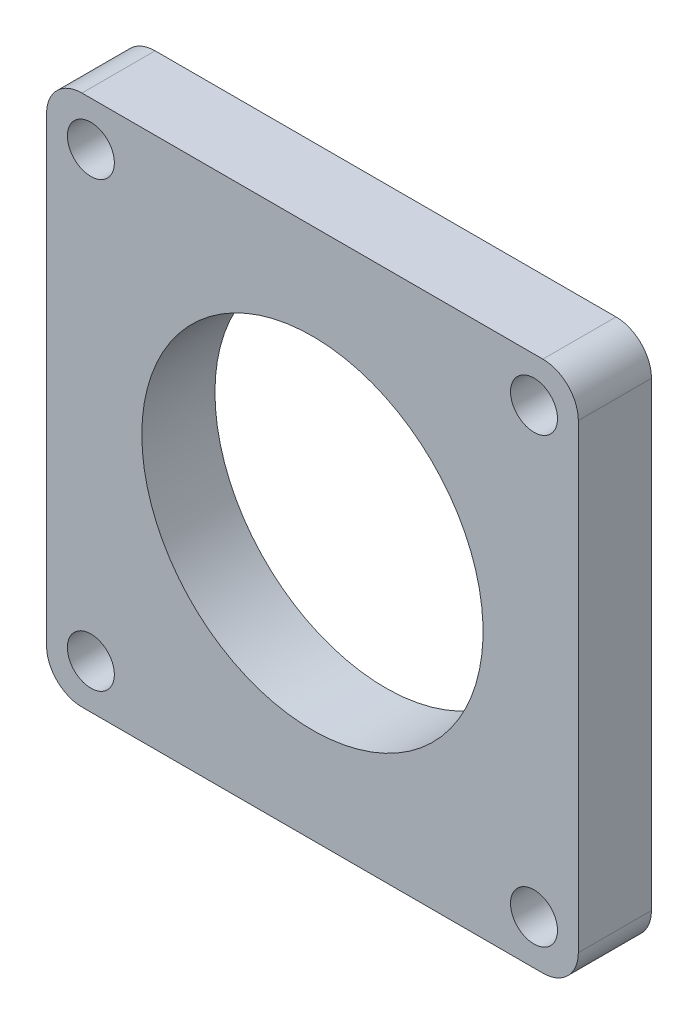
ISO-10303-21;
HEADER;
FILE_DESCRIPTION(('STEP AP214'),'2;1');
FILE_NAME('part.step','',(''),(''),'','','');
FILE_SCHEMA(('AUTOMOTIVE_DESIGN { 1 0 10303 214 1 1 1 1 }'));
ENDSEC;
DATA;
#1=APPLICATION_CONTEXT('core data for automotive mechanical design processes');
#2=APPLICATION_PROTOCOL_DEFINITION('international standard','automotive_design',2000,#1);
#3=PRODUCT_CONTEXT('',#1,'mechanical');
#4=PRODUCT('Part','Part','',(#3));
#5=PRODUCT_RELATED_PRODUCT_CATEGORY('part','',(#4));
#6=PRODUCT_DEFINITION_FORMATION('','',#4);
#7=PRODUCT_DEFINITION_CONTEXT('part definition',#1,'design');
#8=PRODUCT_DEFINITION('design','',#6,#7);
#9=PRODUCT_DEFINITION_SHAPE('','',#8);
#10=(LENGTH_UNIT() NAMED_UNIT(*) SI_UNIT(.MILLI.,.METRE.));
#11=(NAMED_UNIT(*) PLANE_ANGLE_UNIT() SI_UNIT($,.RADIAN.));
#12=(NAMED_UNIT(*) SI_UNIT($,.STERADIAN.) SOLID_ANGLE_UNIT());
#13=UNCERTAINTY_MEASURE_WITH_UNIT(LENGTH_MEASURE(1.E-05),#10,'distance_accuracy_value','');
#14=(GEOMETRIC_REPRESENTATION_CONTEXT(3) GLOBAL_UNCERTAINTY_ASSIGNED_CONTEXT((#13)) GLOBAL_UNIT_ASSIGNED_CONTEXT((#10,
#11,#12)) REPRESENTATION_CONTEXT('',''));
#15=CARTESIAN_POINT('',(0.,0.,0.));
#16=DIRECTION('',(0.,0.,1.));
#17=DIRECTION('',(1.,0.,0.));
#18=AXIS2_PLACEMENT_3D('',#15,#16,#17);
#19=CARTESIAN_POINT('',(26.,-26.,-4.1250000000001));
#20=DIRECTION('',(0.,0.,1.));
#21=DIRECTION('',(1.,0.,0.));
#22=AXIS2_PLACEMENT_3D('',#19,#20,#21);
#23=CYLINDRICAL_SURFACE('',#22,4.00000000000001);
#24=CARTESIAN_POINT('',(26.,-26.,4.12500000000021));
#25=DIRECTION('',(0.,0.,1.));
#26=DIRECTION('',(1.,0.,0.));
#27=AXIS2_PLACEMENT_3D('',#24,#25,#26);
#28=CIRCLE('',#27,4.00000000000001);
#29=CARTESIAN_POINT('',(26.,-30.,4.12500000000021));
#30=VERTEX_POINT('',#29);
#31=CARTESIAN_POINT('',(30.,-26.0000000000001,4.12500000000016));
#32=VERTEX_POINT('',#31);
#33=EDGE_CURVE('E139',#30,#32,#28,.T.);
#34=ORIENTED_EDGE('',*,*,#33,.F.);
#35=DIRECTION('',(0.,0.,1.));
#36=VECTOR('',#35,1.);
#37=CARTESIAN_POINT('',(26.,-30.,-4.1250000000001));
#38=LINE('',#37,#36);
#39=CARTESIAN_POINT('',(26.,-30.,-4.1250000000001));
#40=VERTEX_POINT('',#39);
#41=EDGE_CURVE('E13',#40,#30,#38,.T.);
#42=ORIENTED_EDGE('',*,*,#41,.F.);
#43=CARTESIAN_POINT('',(26.,-26.,-4.1250000000001));
#44=DIRECTION('',(0.,0.,1.));
#45=DIRECTION('',(1.,0.,0.));
#46=AXIS2_PLACEMENT_3D('',#43,#44,#45);
#47=CIRCLE('',#46,4.00000000000001);
#48=CARTESIAN_POINT('',(30.,-26.0000000000001,-4.12500000000016));
#49=VERTEX_POINT('',#48);
#50=EDGE_CURVE('E160',#40,#49,#47,.T.);
#51=ORIENTED_EDGE('',*,*,#50,.T.);
#52=DIRECTION('',(0.,0.,1.));
#53=VECTOR('',#52,1.);
#54=CARTESIAN_POINT('',(30.,-26.0000000000001,-4.12500000000016));
#55=LINE('',#54,#53);
#56=EDGE_CURVE('E45',#49,#32,#55,.T.);
#57=ORIENTED_EDGE('',*,*,#56,.T.);
#58=EDGE_LOOP('',(#34,#42,#51,#57));
#59=FACE_BOUND('',#58,.T.);
#60=ADVANCED_FACE('F42',(#59),#23,.T.);
#61=CARTESIAN_POINT('',(-26.,-30.0000000000001,-4.12499999999993));
#62=DIRECTION('',(0.,-1.,0.));
#63=DIRECTION('',(1.,0.,0.));
#64=AXIS2_PLACEMENT_3D('',#61,#62,#63);
#65=PLANE('',#64);
#66=DIRECTION('',(1.,0.,0.));
#67=VECTOR('',#66,1.);
#68=CARTESIAN_POINT('',(-26.,-29.9999999999999,4.12500000000016));
#69=LINE('',#68,#67);
#70=CARTESIAN_POINT('',(-26.,-29.9999999999999,4.12500000000016));
#71=VERTEX_POINT('',#70);
#72=EDGE_CURVE('E158',#71,#30,#69,.T.);
#73=ORIENTED_EDGE('',*,*,#72,.F.);
#74=DIRECTION('',(0.,0.,1.));
#75=VECTOR('',#74,1.);
#76=CARTESIAN_POINT('',(-26.,-30.0000000000001,-4.12499999999993));
#77=LINE('',#76,#75);
#78=CARTESIAN_POINT('',(-26.,-30.0000000000001,-4.12499999999993));
#79=VERTEX_POINT('',#78);
#80=EDGE_CURVE('E51',#79,#71,#77,.T.);
#81=ORIENTED_EDGE('',*,*,#80,.F.);
#82=DIRECTION('',(1.,0.,0.));
#83=VECTOR('',#82,1.);
#84=CARTESIAN_POINT('',(-26.,-30.0000000000001,-4.12499999999993));
#85=LINE('',#84,#83);
#86=EDGE_CURVE('E129',#79,#40,#85,.T.);
#87=ORIENTED_EDGE('',*,*,#86,.T.);
#88=ORIENTED_EDGE('',*,*,#41,.T.);
#89=EDGE_LOOP('',(#73,#81,#87,#88));
#90=FACE_BOUND('',#89,.T.);
#91=ADVANCED_FACE('F172',(#90),#65,.T.);
#92=CARTESIAN_POINT('',(-26.,-26.0000000000001,-4.12499999999993));
#93=DIRECTION('',(0.,0.,1.));
#94=DIRECTION('',(1.,0.,0.));
#95=AXIS2_PLACEMENT_3D('',#92,#93,#94);
#96=CYLINDRICAL_SURFACE('',#95,4.00000000000001);
#97=CARTESIAN_POINT('',(-26.,-25.9999999999999,4.12500000000016));
#98=DIRECTION('',(0.,0.,1.));
#99=DIRECTION('',(1.,0.,0.));
#100=AXIS2_PLACEMENT_3D('',#97,#98,#99);
#101=CIRCLE('',#100,4.00000000000001);
#102=CARTESIAN_POINT('',(-30.,-26.,4.12500000000021));
#103=VERTEX_POINT('',#102);
#104=EDGE_CURVE('E116',#103,#71,#101,.T.);
#105=ORIENTED_EDGE('',*,*,#104,.F.);
#106=DIRECTION('',(0.,0.,1.));
#107=VECTOR('',#106,1.);
#108=CARTESIAN_POINT('',(-30.,-26.,-4.12499999999966));
#109=LINE('',#108,#107);
#110=CARTESIAN_POINT('',(-30.,-26.,-4.12499999999966));
#111=VERTEX_POINT('',#110);
#112=EDGE_CURVE('E111',#111,#103,#109,.T.);
#113=ORIENTED_EDGE('',*,*,#112,.F.);
#114=CARTESIAN_POINT('',(-26.,-26.0000000000001,-4.12499999999993));
#115=DIRECTION('',(0.,0.,1.));
#116=DIRECTION('',(1.,0.,0.));
#117=AXIS2_PLACEMENT_3D('',#114,#115,#116);
#118=CIRCLE('',#117,4.00000000000001);
#119=EDGE_CURVE('E114',#111,#79,#118,.T.);
#120=ORIENTED_EDGE('',*,*,#119,.T.);
#121=ORIENTED_EDGE('',*,*,#80,.T.);
#122=EDGE_LOOP('',(#105,#113,#120,#121));
#123=FACE_BOUND('',#122,.T.);
#124=ADVANCED_FACE('F113',(#123),#96,.T.);
#125=CARTESIAN_POINT('',(-30.,26.,-4.1250000000001));
#126=DIRECTION('',(-1.,0.,0.));
#127=DIRECTION('',(0.,-1.,0.));
#128=AXIS2_PLACEMENT_3D('',#125,#126,#127);
#129=PLANE('',#128);
#130=DIRECTION('',(0.,-1.,0.));
#131=VECTOR('',#130,1.);
#132=CARTESIAN_POINT('',(-30.,26.0000000000001,4.12500000000021));
#133=LINE('',#132,#131);
#134=CARTESIAN_POINT('',(-30.,26.0000000000001,4.12500000000021));
#135=VERTEX_POINT('',#134);
#136=EDGE_CURVE('E155',#135,#103,#133,.T.);
#137=ORIENTED_EDGE('',*,*,#136,.F.);
#138=DIRECTION('',(0.,0.,1.));
#139=VECTOR('',#138,1.);
#140=CARTESIAN_POINT('',(-30.,26.,-4.1250000000001));
#141=LINE('',#140,#139);
#142=CARTESIAN_POINT('',(-30.,26.,-4.1250000000001));
#143=VERTEX_POINT('',#142);
#144=EDGE_CURVE('E121',#143,#135,#141,.T.);
#145=ORIENTED_EDGE('',*,*,#144,.F.);
#146=DIRECTION('',(0.,-1.,0.));
#147=VECTOR('',#146,1.);
#148=CARTESIAN_POINT('',(-30.,26.,-4.1250000000001));
#149=LINE('',#148,#147);
#150=EDGE_CURVE('E127',#143,#111,#149,.T.);
#151=ORIENTED_EDGE('',*,*,#150,.T.);
#152=ORIENTED_EDGE('',*,*,#112,.T.);
#153=EDGE_LOOP('',(#137,#145,#151,#152));
#154=FACE_BOUND('',#153,.T.);
#155=ADVANCED_FACE('F131',(#154),#129,.T.);
#156=CARTESIAN_POINT('',(-26.,25.9999999999999,-4.12500000000016));
#157=DIRECTION('',(0.,0.,1.));
#158=DIRECTION('',(1.,0.,0.));
#159=AXIS2_PLACEMENT_3D('',#156,#157,#158);
#160=CYLINDRICAL_SURFACE('',#159,4.00000000000001);
#161=CARTESIAN_POINT('',(-26.,26.,4.12500000000016));
#162=DIRECTION('',(0.,0.,1.));
#163=DIRECTION('',(1.,0.,0.));
#164=AXIS2_PLACEMENT_3D('',#161,#162,#163);
#165=CIRCLE('',#164,4.00000000000001);
#166=CARTESIAN_POINT('',(-26.,30.,4.1250000000001));
#167=VERTEX_POINT('',#166);
#168=EDGE_CURVE('E152',#167,#135,#165,.T.);
#169=ORIENTED_EDGE('',*,*,#168,.F.);
#170=DIRECTION('',(0.,0.,1.));
#171=VECTOR('',#170,1.);
#172=CARTESIAN_POINT('',(-26.,29.9999999999999,-4.12500000000021));
#173=LINE('',#172,#171);
#174=CARTESIAN_POINT('',(-26.,29.9999999999999,-4.12500000000021));
#175=VERTEX_POINT('',#174);
#176=EDGE_CURVE('E164',#175,#167,#173,.T.);
#177=ORIENTED_EDGE('',*,*,#176,.F.);
#178=CARTESIAN_POINT('',(-26.,25.9999999999999,-4.12500000000016));
#179=DIRECTION('',(0.,0.,1.));
#180=DIRECTION('',(1.,0.,0.));
#181=AXIS2_PLACEMENT_3D('',#178,#179,#180);
#182=CIRCLE('',#181,4.00000000000001);
#183=EDGE_CURVE('E132',#175,#143,#182,.T.);
#184=ORIENTED_EDGE('',*,*,#183,.T.);
#185=ORIENTED_EDGE('',*,*,#144,.T.);
#186=EDGE_LOOP('',(#169,#177,#184,#185));
#187=FACE_BOUND('',#186,.T.);
#188=ADVANCED_FACE('F185',(#187),#160,.T.);
#189=CARTESIAN_POINT('',(26.,30.,-4.12499999999971));
#190=DIRECTION('',(0.,1.,0.));
#191=DIRECTION('',(-1.,0.,0.));
#192=AXIS2_PLACEMENT_3D('',#189,#190,#191);
#193=PLANE('',#192);
#194=DIRECTION('',(-1.,0.,0.));
#195=VECTOR('',#194,1.);
#196=CARTESIAN_POINT('',(26.,30.,4.12500000000016));
#197=LINE('',#196,#195);
#198=CARTESIAN_POINT('',(26.,30.,4.12500000000016));
#199=VERTEX_POINT('',#198);
#200=EDGE_CURVE('E149',#199,#167,#197,.T.);
#201=ORIENTED_EDGE('',*,*,#200,.F.);
#202=DIRECTION('',(0.,0.,1.));
#203=VECTOR('',#202,1.);
#204=CARTESIAN_POINT('',(26.,30.,-4.12499999999971));
#205=LINE('',#204,#203);
#206=CARTESIAN_POINT('',(26.,30.,-4.12499999999971));
#207=VERTEX_POINT('',#206);
#208=EDGE_CURVE('E166',#207,#199,#205,.T.);
#209=ORIENTED_EDGE('',*,*,#208,.F.);
#210=DIRECTION('',(-1.,0.,0.));
#211=VECTOR('',#210,1.);
#212=CARTESIAN_POINT('',(26.,30.,-4.12499999999971));
#213=LINE('',#212,#211);
#214=EDGE_CURVE('E134',#207,#175,#213,.T.);
#215=ORIENTED_EDGE('',*,*,#214,.T.);
#216=ORIENTED_EDGE('',*,*,#176,.T.);
#217=EDGE_LOOP('',(#201,#209,#215,#216));
#218=FACE_BOUND('',#217,.T.);
#219=ADVANCED_FACE('F188',(#218),#193,.T.);
#220=CARTESIAN_POINT('',(25.9999999999876,26.,-4.12499999999433));
#221=DIRECTION('',(0.,0.,1.));
#222=DIRECTION('',(1.,0.,0.));
#223=AXIS2_PLACEMENT_3D('',#220,#221,#222);
#224=CYLINDRICAL_SURFACE('',#223,4.00000000000001);
#225=CARTESIAN_POINT('',(26.,26.,4.12500000000598));
#226=DIRECTION('',(0.,0.,1.));
#227=DIRECTION('',(1.,0.,0.));
#228=AXIS2_PLACEMENT_3D('',#225,#226,#227);
#229=CIRCLE('',#228,4.00000000000001);
#230=CARTESIAN_POINT('',(30.,25.9999999999999,4.12500000000016));
#231=VERTEX_POINT('',#230);
#232=EDGE_CURVE('E146',#231,#199,#229,.T.);
#233=ORIENTED_EDGE('',*,*,#232,.F.);
#234=DIRECTION('',(0.,0.,1.));
#235=VECTOR('',#234,1.);
#236=CARTESIAN_POINT('',(29.9999999999876,25.9999999999999,-4.12499999999971));
#237=LINE('',#236,#235);
#238=CARTESIAN_POINT('',(29.9999999999876,25.9999999999999,-4.12499999999971));
#239=VERTEX_POINT('',#238);
#240=EDGE_CURVE('E167',#239,#231,#237,.T.);
#241=ORIENTED_EDGE('',*,*,#240,.F.);
#242=CARTESIAN_POINT('',(25.9999999999876,26.,-4.12499999999433));
#243=DIRECTION('',(0.,0.,1.));
#244=DIRECTION('',(1.,0.,0.));
#245=AXIS2_PLACEMENT_3D('',#242,#243,#244);
#246=CIRCLE('',#245,4.00000000000001);
#247=EDGE_CURVE('E264',#239,#207,#246,.T.);
#248=ORIENTED_EDGE('',*,*,#247,.T.);
#249=ORIENTED_EDGE('',*,*,#208,.T.);
#250=EDGE_LOOP('',(#233,#241,#248,#249));
#251=FACE_BOUND('',#250,.T.);
#252=ADVANCED_FACE('F192',(#251),#224,.T.);
#253=CARTESIAN_POINT('',(30.,-26.0000000000001,-4.12500000000016));
#254=DIRECTION('',(1.,0.,0.));
#255=DIRECTION('',(0.,0.,-1.));
#256=AXIS2_PLACEMENT_3D('',#253,#254,#255);
#257=PLANE('',#256);
#258=DIRECTION('',(0.,1.,0.));
#259=VECTOR('',#258,1.);
#260=CARTESIAN_POINT('',(30.,-26.0000000000001,4.12500000000016));
#261=LINE('',#260,#259);
#262=EDGE_CURVE('E142',#32,#231,#261,.T.);
#263=ORIENTED_EDGE('',*,*,#262,.F.);
#264=ORIENTED_EDGE('',*,*,#56,.F.);
#265=DIRECTION('',(0.,1.,0.));
#266=VECTOR('',#265,1.);
#267=CARTESIAN_POINT('',(30.,-26.0000000000001,-4.12500000000016));
#268=LINE('',#267,#266);
#269=EDGE_CURVE('E262',#49,#239,#268,.T.);
#270=ORIENTED_EDGE('',*,*,#269,.T.);
#271=ORIENTED_EDGE('',*,*,#240,.T.);
#272=EDGE_LOOP('',(#263,#264,#270,#271));
#273=FACE_BOUND('',#272,.T.);
#274=ADVANCED_FACE('F169',(#273),#257,.T.);
#275=CARTESIAN_POINT('',(26.,-26.,-4.1250000000001));
#276=DIRECTION('',(0.,0.,1.));
#277=DIRECTION('',(1.,0.,0.));
#278=AXIS2_PLACEMENT_3D('',#275,#276,#277);
#279=PLANE('',#278);
#280=CARTESIAN_POINT('',(24.9999999999877,24.9999999999999,-4.12499999999433));
#281=DIRECTION('',(0.,0.,1.));
#282=DIRECTION('',(-1.,0.,0.));
#283=AXIS2_PLACEMENT_3D('',#280,#281,#282);
#284=CIRCLE('',#283,2.65);
#285=CARTESIAN_POINT('',(22.3499999999877,24.9999999999999,-4.12499999999433));
#286=VERTEX_POINT('',#285);
#287=EDGE_CURVE('E231',#286,#286,#284,.T.);
#288=ORIENTED_EDGE('',*,*,#287,.T.);
#289=EDGE_LOOP('',(#288));
#290=FACE_BOUND('',#289,.T.);
#291=CARTESIAN_POINT('',(25.0000000000001,-25.,-4.1250000000001));
#292=DIRECTION('',(0.,0.,1.));
#293=DIRECTION('',(-1.,0.,0.));
#294=AXIS2_PLACEMENT_3D('',#291,#292,#293);
#295=CIRCLE('',#294,2.65);
#296=CARTESIAN_POINT('',(22.3500000000001,-25.,-4.1250000000001));
#297=VERTEX_POINT('',#296);
#298=EDGE_CURVE('E239',#297,#297,#295,.T.);
#299=ORIENTED_EDGE('',*,*,#298,.T.);
#300=EDGE_LOOP('',(#299));
#301=FACE_BOUND('',#300,.T.);
#302=CARTESIAN_POINT('',(-24.9999999999999,24.9999999999998,-4.12500000000016));
#303=DIRECTION('',(0.,0.,1.));
#304=DIRECTION('',(-1.,0.,0.));
#305=AXIS2_PLACEMENT_3D('',#302,#303,#304);
#306=CIRCLE('',#305,2.65);
#307=CARTESIAN_POINT('',(-27.6499999999999,24.9999999999998,-4.12500000000016));
#308=VERTEX_POINT('',#307);
#309=EDGE_CURVE('E245',#308,#308,#306,.T.);
#310=ORIENTED_EDGE('',*,*,#309,.T.);
#311=EDGE_LOOP('',(#310));
#312=FACE_BOUND('',#311,.T.);
#313=CARTESIAN_POINT('',(-25.0000000000001,-25.,-4.12499999999993));
#314=DIRECTION('',(0.,0.,1.));
#315=DIRECTION('',(-1.,0.,0.));
#316=AXIS2_PLACEMENT_3D('',#313,#314,#315);
#317=CIRCLE('',#316,2.65);
#318=CARTESIAN_POINT('',(-27.6500000000001,-25.,-4.12499999999993));
#319=VERTEX_POINT('',#318);
#320=EDGE_CURVE('E251',#319,#319,#317,.T.);
#321=ORIENTED_EDGE('',*,*,#320,.T.);
#322=EDGE_LOOP('',(#321));
#323=FACE_BOUND('',#322,.T.);
#324=CARTESIAN_POINT('',(0.,0.,-4.12500000000016));
#325=DIRECTION('',(0.,0.,1.));
#326=DIRECTION('',(-1.,0.,0.));
#327=AXIS2_PLACEMENT_3D('',#324,#325,#326);
#328=CIRCLE('',#327,19.25);
#329=CARTESIAN_POINT('',(-19.25,0.,-4.12500000000016));
#330=VERTEX_POINT('',#329);
#331=EDGE_CURVE('E143',#330,#330,#328,.T.);
#332=ORIENTED_EDGE('',*,*,#331,.T.);
#333=EDGE_LOOP('',(#332));
#334=FACE_BOUND('',#333,.T.);
#335=ORIENTED_EDGE('',*,*,#50,.F.);
#336=ORIENTED_EDGE('',*,*,#86,.F.);
#337=ORIENTED_EDGE('',*,*,#119,.F.);
#338=ORIENTED_EDGE('',*,*,#150,.F.);
#339=ORIENTED_EDGE('',*,*,#183,.F.);
#340=ORIENTED_EDGE('',*,*,#214,.F.);
#341=ORIENTED_EDGE('',*,*,#247,.F.);
#342=ORIENTED_EDGE('',*,*,#269,.F.);
#343=EDGE_LOOP('',(#335,#336,#337,#338,#339,#340,#341,#342));
#344=FACE_BOUND('',#343,.T.);
#345=ADVANCED_FACE('F125',(#290,#301,#312,#323,#334,#344),#279,.F.);
#346=CARTESIAN_POINT('',(26.,-26.,4.12500000000021));
#347=DIRECTION('',(0.,0.,1.));
#348=DIRECTION('',(1.,0.,0.));
#349=AXIS2_PLACEMENT_3D('',#346,#347,#348);
#350=PLANE('',#349);
#351=CARTESIAN_POINT('',(24.9999999999999,24.9999999999999,4.12500000000598));
#352=DIRECTION('',(0.,0.,1.));
#353=DIRECTION('',(-1.,0.,0.));
#354=AXIS2_PLACEMENT_3D('',#351,#352,#353);
#355=CIRCLE('',#354,2.65);
#356=CARTESIAN_POINT('',(22.3499999999999,24.9999999999999,4.12500000000598));
#357=VERTEX_POINT('',#356);
#358=EDGE_CURVE('E234',#357,#357,#355,.T.);
#359=ORIENTED_EDGE('',*,*,#358,.F.);
#360=EDGE_LOOP('',(#359));
#361=FACE_BOUND('',#360,.T.);
#362=CARTESIAN_POINT('',(25.0000000000001,-25.,4.12500000000021));
#363=DIRECTION('',(0.,0.,1.));
#364=DIRECTION('',(-1.,0.,0.));
#365=AXIS2_PLACEMENT_3D('',#362,#363,#364);
#366=CIRCLE('',#365,2.65);
#367=CARTESIAN_POINT('',(22.3500000000001,-25.,4.12500000000021));
#368=VERTEX_POINT('',#367);
#369=EDGE_CURVE('E236',#368,#368,#366,.T.);
#370=ORIENTED_EDGE('',*,*,#369,.F.);
#371=EDGE_LOOP('',(#370));
#372=FACE_BOUND('',#371,.T.);
#373=CARTESIAN_POINT('',(-24.9999999999999,25.0000000000001,4.12500000000016));
#374=DIRECTION('',(0.,0.,1.));
#375=DIRECTION('',(-1.,0.,0.));
#376=AXIS2_PLACEMENT_3D('',#373,#374,#375);
#377=CIRCLE('',#376,2.65);
#378=CARTESIAN_POINT('',(-27.6499999999999,25.0000000000001,4.12500000000016));
#379=VERTEX_POINT('',#378);
#380=EDGE_CURVE('E242',#379,#379,#377,.T.);
#381=ORIENTED_EDGE('',*,*,#380,.F.);
#382=EDGE_LOOP('',(#381));
#383=FACE_BOUND('',#382,.T.);
#384=CARTESIAN_POINT('',(-25.0000000000001,-25.,4.12500000000016));
#385=DIRECTION('',(0.,0.,1.));
#386=DIRECTION('',(-1.,0.,0.));
#387=AXIS2_PLACEMENT_3D('',#384,#385,#386);
#388=CIRCLE('',#387,2.65);
#389=CARTESIAN_POINT('',(-27.6500000000001,-25.,4.12500000000016));
#390=VERTEX_POINT('',#389);
#391=EDGE_CURVE('E248',#390,#390,#388,.T.);
#392=ORIENTED_EDGE('',*,*,#391,.F.);
#393=EDGE_LOOP('',(#392));
#394=FACE_BOUND('',#393,.T.);
#395=CARTESIAN_POINT('',(0.,0.,4.12500000000016));
#396=DIRECTION('',(0.,0.,1.));
#397=DIRECTION('',(-1.,0.,0.));
#398=AXIS2_PLACEMENT_3D('',#395,#396,#397);
#399=CIRCLE('',#398,19.25);
#400=CARTESIAN_POINT('',(-19.25,0.,4.12500000000016));
#401=VERTEX_POINT('',#400);
#402=EDGE_CURVE('E254',#401,#401,#399,.T.);
#403=ORIENTED_EDGE('',*,*,#402,.F.);
#404=EDGE_LOOP('',(#403));
#405=FACE_BOUND('',#404,.T.);
#406=ORIENTED_EDGE('',*,*,#33,.T.);
#407=ORIENTED_EDGE('',*,*,#262,.T.);
#408=ORIENTED_EDGE('',*,*,#232,.T.);
#409=ORIENTED_EDGE('',*,*,#200,.T.);
#410=ORIENTED_EDGE('',*,*,#168,.T.);
#411=ORIENTED_EDGE('',*,*,#136,.T.);
#412=ORIENTED_EDGE('',*,*,#104,.T.);
#413=ORIENTED_EDGE('',*,*,#72,.T.);
#414=EDGE_LOOP('',(#406,#407,#408,#409,#410,#411,#412,#413));
#415=FACE_BOUND('',#414,.T.);
#416=ADVANCED_FACE('F171',(#361,#372,#383,#394,#405,#415),#350,.T.);
#417=CARTESIAN_POINT('',(0.,0.,-4.12500000000016));
#418=DIRECTION('',(0.,0.,1.));
#419=DIRECTION('',(1.,0.,0.));
#420=AXIS2_PLACEMENT_3D('',#417,#418,#419);
#421=CYLINDRICAL_SURFACE('',#420,19.25);
#422=ORIENTED_EDGE('',*,*,#331,.F.);
#423=EDGE_LOOP('',(#422));
#424=FACE_BOUND('',#423,.T.);
#425=ORIENTED_EDGE('',*,*,#402,.T.);
#426=EDGE_LOOP('',(#425));
#427=FACE_BOUND('',#426,.T.);
#428=ADVANCED_FACE('F204',(#424,#427),#421,.F.);
#429=CARTESIAN_POINT('',(-25.0000000000001,-25.,-4.12499999999993));
#430=DIRECTION('',(0.,0.,1.));
#431=DIRECTION('',(1.,0.,0.));
#432=AXIS2_PLACEMENT_3D('',#429,#430,#431);
#433=CYLINDRICAL_SURFACE('',#432,2.65);
#434=ORIENTED_EDGE('',*,*,#320,.F.);
#435=EDGE_LOOP('',(#434));
#436=FACE_BOUND('',#435,.T.);
#437=ORIENTED_EDGE('',*,*,#391,.T.);
#438=EDGE_LOOP('',(#437));
#439=FACE_BOUND('',#438,.T.);
#440=ADVANCED_FACE('F211',(#436,#439),#433,.F.);
#441=CARTESIAN_POINT('',(-24.9999999999999,24.9999999999998,-4.12500000000016));
#442=DIRECTION('',(0.,0.,1.));
#443=DIRECTION('',(1.,0.,0.));
#444=AXIS2_PLACEMENT_3D('',#441,#442,#443);
#445=CYLINDRICAL_SURFACE('',#444,2.65);
#446=ORIENTED_EDGE('',*,*,#309,.F.);
#447=EDGE_LOOP('',(#446));
#448=FACE_BOUND('',#447,.T.);
#449=ORIENTED_EDGE('',*,*,#380,.T.);
#450=EDGE_LOOP('',(#449));
#451=FACE_BOUND('',#450,.T.);
#452=ADVANCED_FACE('F215',(#448,#451),#445,.F.);
#453=CARTESIAN_POINT('',(25.0000000000001,-25.,-4.1250000000001));
#454=DIRECTION('',(0.,0.,1.));
#455=DIRECTION('',(1.,0.,0.));
#456=AXIS2_PLACEMENT_3D('',#453,#454,#455);
#457=CYLINDRICAL_SURFACE('',#456,2.65);
#458=ORIENTED_EDGE('',*,*,#298,.F.);
#459=EDGE_LOOP('',(#458));
#460=FACE_BOUND('',#459,.T.);
#461=ORIENTED_EDGE('',*,*,#369,.T.);
#462=EDGE_LOOP('',(#461));
#463=FACE_BOUND('',#462,.T.);
#464=ADVANCED_FACE('F219',(#460,#463),#457,.F.);
#465=CARTESIAN_POINT('',(24.9999999999877,24.9999999999999,-4.12499999999433));
#466=DIRECTION('',(0.,0.,1.));
#467=DIRECTION('',(1.,0.,0.));
#468=AXIS2_PLACEMENT_3D('',#465,#466,#467);
#469=CYLINDRICAL_SURFACE('',#468,2.65);
#470=ORIENTED_EDGE('',*,*,#287,.F.);
#471=EDGE_LOOP('',(#470));
#472=FACE_BOUND('',#471,.T.);
#473=ORIENTED_EDGE('',*,*,#358,.T.);
#474=EDGE_LOOP('',(#473));
#475=FACE_BOUND('',#474,.T.);
#476=ADVANCED_FACE('F223',(#472,#475),#469,.F.);
#477=CLOSED_SHELL('',(#60,#91,#124,#155,#188,#219,#252,#274,#345,#416,#428,#440,#452,#464,#476));
#478=MANIFOLD_SOLID_BREP('B2',#477);
#479=ADVANCED_BREP_SHAPE_REPRESENTATION('',(#18,#478),#14);
#480=SHAPE_DEFINITION_REPRESENTATION(#9,#479);
ENDSEC;
END-ISO-10303-21;
